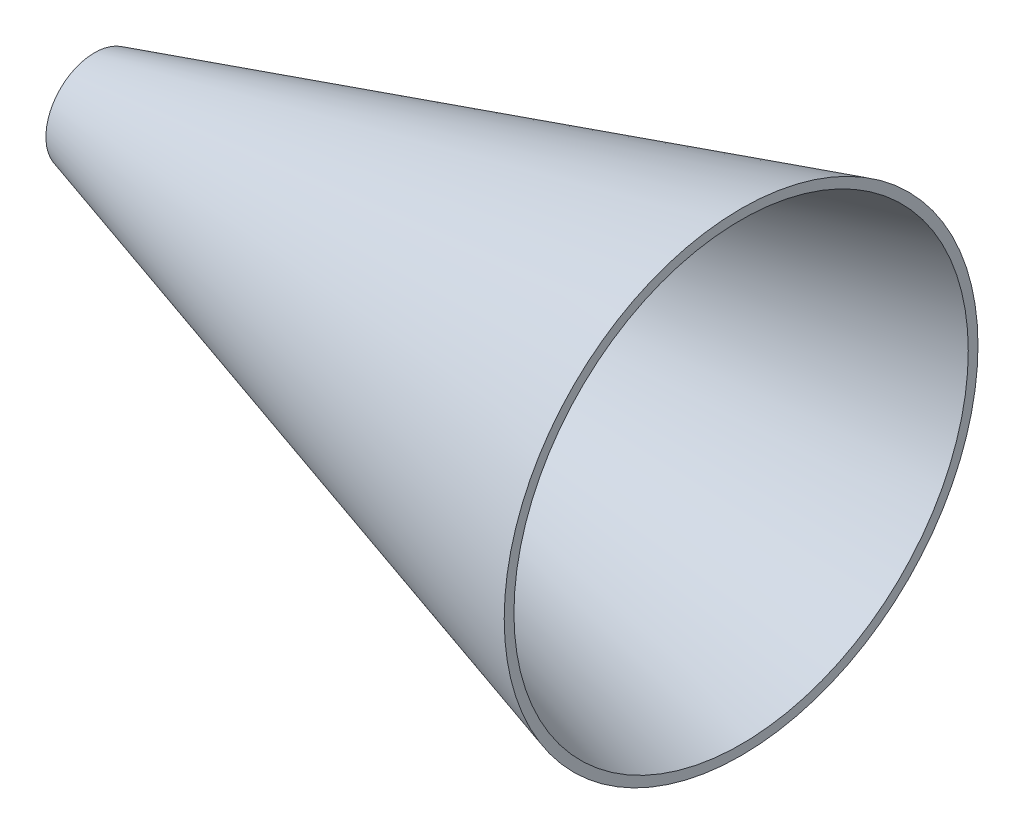
ISO-10303-21;
HEADER;
FILE_DESCRIPTION(('STEP AP214'),'2;1');
FILE_NAME('part.step','',(''),(''),'','','');
FILE_SCHEMA(('AUTOMOTIVE_DESIGN { 1 0 10303 214 1 1 1 1 }'));
ENDSEC;
DATA;
#1=APPLICATION_CONTEXT('core data for automotive mechanical design processes');
#2=APPLICATION_PROTOCOL_DEFINITION('international standard','automotive_design',2000,#1);
#3=PRODUCT_CONTEXT('',#1,'mechanical');
#4=PRODUCT('Part','Part','',(#3));
#5=PRODUCT_RELATED_PRODUCT_CATEGORY('part','',(#4));
#6=PRODUCT_DEFINITION_FORMATION('','',#4);
#7=PRODUCT_DEFINITION_CONTEXT('part definition',#1,'design');
#8=PRODUCT_DEFINITION('design','',#6,#7);
#9=PRODUCT_DEFINITION_SHAPE('','',#8);
#10=(LENGTH_UNIT() NAMED_UNIT(*) SI_UNIT(.MILLI.,.METRE.));
#11=(NAMED_UNIT(*) PLANE_ANGLE_UNIT() SI_UNIT($,.RADIAN.));
#12=(NAMED_UNIT(*) SI_UNIT($,.STERADIAN.) SOLID_ANGLE_UNIT());
#13=UNCERTAINTY_MEASURE_WITH_UNIT(LENGTH_MEASURE(1.E-05),#10,'distance_accuracy_value','');
#14=(GEOMETRIC_REPRESENTATION_CONTEXT(3) GLOBAL_UNCERTAINTY_ASSIGNED_CONTEXT((#13)) GLOBAL_UNIT_ASSIGNED_CONTEXT((#10,
#11,#12)) REPRESENTATION_CONTEXT('',''));
#15=CARTESIAN_POINT('',(0.,0.,0.));
#16=DIRECTION('',(0.,0.,1.));
#17=DIRECTION('',(1.,0.,0.));
#18=AXIS2_PLACEMENT_3D('',#15,#16,#17);
#19=CARTESIAN_POINT('',(0.,0.,0.));
#20=DIRECTION('',(1.,0.,0.));
#21=DIRECTION('',(0.,0.,-1.));
#22=AXIS2_PLACEMENT_3D('',#19,#20,#21);
#23=PLANE('',#22);
#24=CARTESIAN_POINT('',(0.,0.,0.));
#25=DIRECTION('',(-1.,0.,0.));
#26=DIRECTION('',(0.,0.,1.));
#27=AXIS2_PLACEMENT_3D('',#24,#25,#26);
#28=CIRCLE('',#27,1.016);
#29=CARTESIAN_POINT('',(0.,0.,1.016));
#30=VERTEX_POINT('',#29);
#31=EDGE_CURVE('E60',#30,#30,#28,.T.);
#32=ORIENTED_EDGE('',*,*,#31,.F.);
#33=EDGE_LOOP('',(#32));
#34=FACE_BOUND('',#33,.T.);
#35=CARTESIAN_POINT('',(0.,0.,0.));
#36=DIRECTION('',(-1.,0.,0.));
#37=DIRECTION('',(0.,0.,1.));
#38=AXIS2_PLACEMENT_3D('',#35,#36,#37);
#39=CIRCLE('',#38,1.27);
#40=CARTESIAN_POINT('',(0.,0.,-1.27));
#41=VERTEX_POINT('',#40);
#42=EDGE_CURVE('E10',#41,#41,#39,.T.);
#43=ORIENTED_EDGE('',*,*,#42,.T.);
#44=EDGE_LOOP('',(#43));
#45=FACE_BOUND('',#44,.T.);
#46=ADVANCED_FACE('F36',(#34,#45),#23,.F.);
#47=CARTESIAN_POINT('',(16.891,0.,0.));
#48=DIRECTION('',(1.,0.,0.));
#49=DIRECTION('',(0.,0.,-1.));
#50=AXIS2_PLACEMENT_3D('',#47,#48,#49);
#51=CONICAL_SURFACE('',#50,6.18865496633617,0.28336374422544);
#52=CARTESIAN_POINT('',(16.891,0.,0.));
#53=DIRECTION('',(-1.,0.,0.));
#54=DIRECTION('',(0.,0.,1.));
#55=AXIS2_PLACEMENT_3D('',#52,#53,#54);
#56=CIRCLE('',#55,6.18865496633617);
#57=CARTESIAN_POINT('',(16.891,0.,-6.18865496633617));
#58=VERTEX_POINT('',#57);
#59=EDGE_CURVE('E44',#58,#58,#56,.T.);
#60=CARTESIAN_POINT('',(0.,0.,-1.27));
#61=CARTESIAN_POINT('',(0.175947916666666,0.,-1.32123598923267));
#62=CARTESIAN_POINT('',(0.351895833333333,0.,-1.37247197846534));
#63=CARTESIAN_POINT('',(0.703791666666666,0.,-1.47494395693067));
#64=CARTESIAN_POINT('',(0.879739583333333,0.,-1.52617994616334));
#65=CARTESIAN_POINT('',(1.23163541666667,0.,-1.62865192462868));
#66=CARTESIAN_POINT('',(1.40758333333333,0.,-1.67988791386135));
#67=CARTESIAN_POINT('',(1.75947916666667,0.,-1.78235989232668));
#68=CARTESIAN_POINT('',(1.93542708333333,0.,-1.83359588155935));
#69=CARTESIAN_POINT('',(2.28732291666667,0.,-1.93606786002469));
#70=CARTESIAN_POINT('',(2.46327083333333,0.,-1.98730384925736));
#71=CARTESIAN_POINT('',(2.81516666666667,0.,-2.0897758277227));
#72=CARTESIAN_POINT('',(2.99111458333333,0.,-2.14101181695537));
#73=CARTESIAN_POINT('',(3.34301041666667,0.,-2.2434837954207));
#74=CARTESIAN_POINT('',(3.51895833333333,0.,-2.29471978465337));
#75=CARTESIAN_POINT('',(3.87085416666667,0.,-2.39719176311871));
#76=CARTESIAN_POINT('',(4.04680208333333,0.,-2.44842775235138));
#77=CARTESIAN_POINT('',(4.39869791666667,0.,-2.55089973081671));
#78=CARTESIAN_POINT('',(4.57464583333334,0.,-2.60213572004938));
#79=CARTESIAN_POINT('',(4.92654166666667,0.,-2.70460769851472));
#80=CARTESIAN_POINT('',(5.10248958333334,0.,-2.75584368774739));
#81=CARTESIAN_POINT('',(5.45438541666667,0.,-2.85831566621272));
#82=CARTESIAN_POINT('',(5.63033333333334,0.,-2.90955165544539));
#83=CARTESIAN_POINT('',(5.98222916666667,0.,-3.01202363391073));
#84=CARTESIAN_POINT('',(6.15817708333334,0.,-3.0632596231434));
#85=CARTESIAN_POINT('',(6.51007291666667,0.,-3.16573160160873));
#86=CARTESIAN_POINT('',(6.68602083333334,0.,-3.2169675908414));
#87=CARTESIAN_POINT('',(7.03791666666667,0.,-3.31943956930674));
#88=CARTESIAN_POINT('',(7.21386458333334,0.,-3.37067555853941));
#89=CARTESIAN_POINT('',(7.56576041666667,0.,-3.47314753700474));
#90=CARTESIAN_POINT('',(7.74170833333334,0.,-3.52438352623741));
#91=CARTESIAN_POINT('',(8.09360416666667,0.,-3.62685550470275));
#92=CARTESIAN_POINT('',(8.26955208333334,0.,-3.67809149393542));
#93=CARTESIAN_POINT('',(8.62144791666667,0.,-3.78056347240076));
#94=CARTESIAN_POINT('',(8.79739583333334,0.,-3.83179946163342));
#95=CARTESIAN_POINT('',(9.14929166666667,0.,-3.93427144009876));
#96=CARTESIAN_POINT('',(9.32523958333334,0.,-3.98550742933143));
#97=CARTESIAN_POINT('',(9.67713541666667,0.,-4.08797940779677));
#98=CARTESIAN_POINT('',(9.85308333333334,0.,-4.13921539702944));
#99=CARTESIAN_POINT('',(10.2049791666667,0.,-4.24168737549477));
#100=CARTESIAN_POINT('',(10.3809270833333,0.,-4.29292336472744));
#101=CARTESIAN_POINT('',(10.7328229166667,0.,-4.39539534319278));
#102=CARTESIAN_POINT('',(10.9087708333333,0.,-4.44663133242545));
#103=CARTESIAN_POINT('',(11.2606666666667,0.,-4.54910331089078));
#104=CARTESIAN_POINT('',(11.4366145833333,0.,-4.60033930012345));
#105=CARTESIAN_POINT('',(11.7885104166667,0.,-4.70281127858879));
#106=CARTESIAN_POINT('',(11.9644583333333,0.,-4.75404726782146));
#107=CARTESIAN_POINT('',(12.3163541666667,0.,-4.85651924628679));
#108=CARTESIAN_POINT('',(12.4923020833333,0.,-4.90775523551946));
#109=CARTESIAN_POINT('',(12.8441979166667,0.,-5.0102272139848));
#110=CARTESIAN_POINT('',(13.0201458333333,0.,-5.06146320321747));
#111=CARTESIAN_POINT('',(13.3720416666667,0.,-5.16393518168281));
#112=CARTESIAN_POINT('',(13.5479895833333,0.,-5.21517117091547));
#113=CARTESIAN_POINT('',(13.8998854166667,0.,-5.31764314938081));
#114=CARTESIAN_POINT('',(14.0758333333333,0.,-5.36887913861348));
#115=CARTESIAN_POINT('',(14.4277291666667,0.,-5.47135111707882));
#116=CARTESIAN_POINT('',(14.6036770833333,0.,-5.52258710631148));
#117=CARTESIAN_POINT('',(14.9555729166667,0.,-5.62505908477682));
#118=CARTESIAN_POINT('',(15.1315208333333,0.,-5.67629507400949));
#119=CARTESIAN_POINT('',(15.4834166666667,0.,-5.77876705247483));
#120=CARTESIAN_POINT('',(15.6593645833333,0.,-5.8300030417075));
#121=CARTESIAN_POINT('',(16.0112604166667,0.,-5.93247502017283));
#122=CARTESIAN_POINT('',(16.1872083333333,0.,-5.9837110094055));
#123=CARTESIAN_POINT('',(16.5391041666667,0.,-6.08618298787084));
#124=CARTESIAN_POINT('',(16.7150520833333,0.,-6.13741897710351));
#125=CARTESIAN_POINT('',(16.891,0.,-6.18865496633617));
#126=B_SPLINE_CURVE_WITH_KNOTS('',3,(#60,#61,#62,#63,#64,#65,#66,#67,#68,#69,#70,#71,#72,#73,
#74,#75,#76,#77,#78,#79,#80,#81,#82,#83,#84,#85,#86,#87,#88,#89,#90,#91,#92,#93,#94,#95,#96,#97,
#98,#99,#100,#101,#102,#103,#104,#105,#106,#107,#108,#109,#110,#111,#112,#113,#114,#115,#116,
#117,#118,#119,#120,#121,#122,#123,#124,#125),.UNSPECIFIED.,.F.,.F.,(4,2,2,2,2,2,2,2,2,2,2,2,2,
2,2,2,2,2,2,2,2,2,2,2,2,2,2,2,2,2,2,2,4),(0.,0.549768281867837,1.09953656373567,
1.64930484560351,2.19907312747135,2.74884140933919,3.29860969120702,3.84837797307486,
4.3981462549427,4.94791453681054,5.49768281867837,6.04745110054621,6.59721938241405,
7.14698766428189,7.69675594614972,8.24652422801756,8.7962925098854,9.34606079175324,
9.89582907362107,10.4455973554889,10.9953656373567,11.5451339192246,12.0949022010924,
12.6446704829603,13.1944387648281,13.7442070466959,14.2939753285638,14.8437436104316,
15.3935118922995,15.9432801741673,16.4930484560351,17.042816737903,17.5925850197708),.UNSPECIFIED.);
#127=EDGE_CURVE('BSEAM83',#41,#58,#126,.T.);
#128=ORIENTED_EDGE('',*,*,#42,.F.);
#129=ORIENTED_EDGE('',*,*,#59,.T.);
#130=ORIENTED_EDGE('',*,*,#127,.T.);
#131=ORIENTED_EDGE('',*,*,#127,.F.);
#132=EDGE_LOOP('',(#128,#130,#129,#131));
#133=FACE_BOUND('',#132,.T.);
#134=ADVANCED_FACE('F83',(#133),#51,.T.);
#135=CARTESIAN_POINT('',(16.891,6.18865496633617,0.));
#136=DIRECTION('',(-1.,0.,0.));
#137=DIRECTION('',(0.,0.,1.));
#138=AXIS2_PLACEMENT_3D('',#135,#136,#137);
#139=PLANE('',#138);
#140=ORIENTED_EDGE('',*,*,#59,.F.);
#141=EDGE_LOOP('',(#140));
#142=FACE_BOUND('',#141,.T.);
#143=CARTESIAN_POINT('',(16.891,0.,0.));
#144=DIRECTION('',(-1.,0.,0.));
#145=DIRECTION('',(0.,0.,1.));
#146=AXIS2_PLACEMENT_3D('',#143,#144,#145);
#147=CIRCLE('',#146,5.93465496633617);
#148=CARTESIAN_POINT('',(16.891,0.,-5.93465496633617));
#149=VERTEX_POINT('',#148);
#150=EDGE_CURVE('E50',#149,#149,#147,.T.);
#151=ORIENTED_EDGE('',*,*,#150,.T.);
#152=EDGE_LOOP('',(#151));
#153=FACE_BOUND('',#152,.T.);
#154=ADVANCED_FACE('F88',(#142,#153),#139,.F.);
#155=CARTESIAN_POINT('',(0.254000000000004,0.,0.));
#156=DIRECTION('',(1.,0.,0.));
#157=DIRECTION('',(0.,0.,-1.));
#158=AXIS2_PLACEMENT_3D('',#155,#156,#157);
#159=CONICAL_SURFACE('',#158,1.08996473633588,0.28336374422544);
#160=CARTESIAN_POINT('',(0.254000000000004,0.,0.));
#161=DIRECTION('',(-1.,0.,0.));
#162=DIRECTION('',(0.,0.,1.));
#163=AXIS2_PLACEMENT_3D('',#160,#161,#162);
#164=CIRCLE('',#163,1.08996473633588);
#165=CARTESIAN_POINT('',(0.254000000000004,0.,-1.08996473633588));
#166=VERTEX_POINT('',#165);
#167=EDGE_CURVE('E56',#166,#166,#164,.T.);
#168=CARTESIAN_POINT('',(16.891,0.,-5.93465496633617));
#169=CARTESIAN_POINT('',(16.7176979166667,0.,-5.884189443107));
#170=CARTESIAN_POINT('',(16.5443958333333,0.,-5.83372391987783));
#171=CARTESIAN_POINT('',(16.1977916666667,0.,-5.73279287341949));
#172=CARTESIAN_POINT('',(16.0244895833333,0.,-5.68232735019033));
#173=CARTESIAN_POINT('',(15.6778854166667,0.,-5.58139630373199));
#174=CARTESIAN_POINT('',(15.5045833333333,0.,-5.53093078050282));
#175=CARTESIAN_POINT('',(15.1579791666667,0.,-5.42999973404448));
#176=CARTESIAN_POINT('',(14.9846770833333,0.,-5.37953421081531));
#177=CARTESIAN_POINT('',(14.6380729166667,0.,-5.27860316435697));
#178=CARTESIAN_POINT('',(14.4647708333333,0.,-5.2281376411278));
#179=CARTESIAN_POINT('',(14.1181666666667,0.,-5.12720659466946));
#180=CARTESIAN_POINT('',(13.9448645833333,0.,-5.07674107144029));
#181=CARTESIAN_POINT('',(13.5982604166667,0.,-4.97581002498195));
#182=CARTESIAN_POINT('',(13.4249583333333,0.,-4.92534450175278));
#183=CARTESIAN_POINT('',(13.0783541666667,0.,-4.82441345529444));
#184=CARTESIAN_POINT('',(12.9050520833333,0.,-4.77394793206527));
#185=CARTESIAN_POINT('',(12.5584479166667,0.,-4.67301688560693));
#186=CARTESIAN_POINT('',(12.3851458333333,0.,-4.62255136237776));
#187=CARTESIAN_POINT('',(12.0385416666667,0.,-4.52162031591942));
#188=CARTESIAN_POINT('',(11.8652395833333,0.,-4.47115479269025));
#189=CARTESIAN_POINT('',(11.5186354166667,0.,-4.37022374623191));
#190=CARTESIAN_POINT('',(11.3453333333333,0.,-4.31975822300274));
#191=CARTESIAN_POINT('',(10.9987291666667,0.,-4.2188271765444));
#192=CARTESIAN_POINT('',(10.8254270833333,0.,-4.16836165331523));
#193=CARTESIAN_POINT('',(10.4788229166667,0.,-4.0674306068569));
#194=CARTESIAN_POINT('',(10.3055208333333,0.,-4.01696508362772));
#195=CARTESIAN_POINT('',(9.95891666666667,0.,-3.91603403716939));
#196=CARTESIAN_POINT('',(9.78561458333334,0.,-3.86556851394022));
#197=CARTESIAN_POINT('',(9.43901041666667,0.,-3.76463746748188));
#198=CARTESIAN_POINT('',(9.26570833333334,0.,-3.71417194425271));
#199=CARTESIAN_POINT('',(8.91910416666667,0.,-3.61324089779437));
#200=CARTESIAN_POINT('',(8.74580208333334,0.,-3.5627753745652));
#201=CARTESIAN_POINT('',(8.39919791666667,0.,-3.46184432810686));
#202=CARTESIAN_POINT('',(8.22589583333334,0.,-3.41137880487769));
#203=CARTESIAN_POINT('',(7.87929166666667,0.,-3.31044775841935));
#204=CARTESIAN_POINT('',(7.70598958333334,0.,-3.25998223519018));
#205=CARTESIAN_POINT('',(7.35938541666667,0.,-3.15905118873184));
#206=CARTESIAN_POINT('',(7.18608333333334,0.,-3.10858566550267));
#207=CARTESIAN_POINT('',(6.83947916666667,0.,-3.00765461904433));
#208=CARTESIAN_POINT('',(6.66617708333334,0.,-2.95718909581516));
#209=CARTESIAN_POINT('',(6.31957291666667,0.,-2.85625804935682));
#210=CARTESIAN_POINT('',(6.14627083333334,0.,-2.80579252612765));
#211=CARTESIAN_POINT('',(5.79966666666667,0.,-2.70486147966931));
#212=CARTESIAN_POINT('',(5.62636458333334,0.,-2.65439595644014));
#213=CARTESIAN_POINT('',(5.27976041666667,0.,-2.5534649099818));
#214=CARTESIAN_POINT('',(5.10645833333334,0.,-2.50299938675263));
#215=CARTESIAN_POINT('',(4.75985416666667,0.,-2.40206834029429));
#216=CARTESIAN_POINT('',(4.58655208333334,0.,-2.35160281706512));
#217=CARTESIAN_POINT('',(4.23994791666667,0.,-2.25067177060678));
#218=CARTESIAN_POINT('',(4.06664583333334,0.,-2.20020624737761));
#219=CARTESIAN_POINT('',(3.72004166666667,0.,-2.09927520091927));
#220=CARTESIAN_POINT('',(3.54673958333334,0.,-2.0488096776901));
#221=CARTESIAN_POINT('',(3.20013541666667,0.,-1.94787863123177));
#222=CARTESIAN_POINT('',(3.02683333333334,0.,-1.8974131080026));
#223=CARTESIAN_POINT('',(2.68022916666667,0.,-1.79648206154426));
#224=CARTESIAN_POINT('',(2.50692708333334,0.,-1.74601653831509));
#225=CARTESIAN_POINT('',(2.16032291666667,0.,-1.64508549185675));
#226=CARTESIAN_POINT('',(1.98702083333334,0.,-1.59461996862758));
#227=CARTESIAN_POINT('',(1.64041666666667,0.,-1.49368892216924));
#228=CARTESIAN_POINT('',(1.46711458333334,0.,-1.44322339894007));
#229=CARTESIAN_POINT('',(1.12051041666667,0.,-1.34229235248173));
#230=CARTESIAN_POINT('',(0.947208333333338,0.,-1.29182682925256));
#231=CARTESIAN_POINT('',(0.600604166666671,0.,-1.19089578279422));
#232=CARTESIAN_POINT('',(0.427302083333338,0.,-1.14043025956505));
#233=CARTESIAN_POINT('',(0.254000000000004,0.,-1.08996473633588));
#234=B_SPLINE_CURVE_WITH_KNOTS('',3,(#168,#169,#170,#171,#172,#173,#174,#175,#176,#177,#178,
#179,#180,#181,#182,#183,#184,#185,#186,#187,#188,#189,#190,#191,#192,#193,#194,#195,#196,#197,
#198,#199,#200,#201,#202,#203,#204,#205,#206,#207,#208,#209,#210,#211,#212,#213,#214,#215,#216,
#217,#218,#219,#220,#221,#222,#223,#224,#225,#226,#227,#228,#229,#230,#231,#232,#233),
.UNSPECIFIED.,.F.,.F.,(4,2,2,2,2,2,2,2,2,2,2,2,2,2,2,2,2,2,2,2,2,2,2,2,2,2,2,2,2,2,2,2,4),(0.,
0.541501089659299,1.0830021793186,1.62450326897789,2.16600435863719,2.70750544829649,
3.24900653795579,3.79050762761509,4.33200871727439,4.87350980693368,5.41501089659298,
5.95651198625228,6.49801307591158,7.03951416557088,7.58101525523018,8.12251634488947,
8.66401743454877,9.20551852420807,9.74701961386737,10.2885207035267,10.830021793186,
11.3715228828453,11.9130239725046,12.4545250621639,12.9960261518232,13.5375272414825,
14.0790283311418,14.6205294208011,15.1620305104604,15.7035316001197,16.2450326897789,
16.7865337794382,17.3280348690975),.UNSPECIFIED.);
#235=EDGE_CURVE('BSEAM80',#149,#166,#234,.T.);
#236=ORIENTED_EDGE('',*,*,#150,.F.);
#237=ORIENTED_EDGE('',*,*,#167,.T.);
#238=ORIENTED_EDGE('',*,*,#235,.T.);
#239=ORIENTED_EDGE('',*,*,#235,.F.);
#240=EDGE_LOOP('',(#236,#238,#237,#239));
#241=FACE_BOUND('',#240,.T.);
#242=ADVANCED_FACE('F80',(#241),#159,.F.);
#243=CARTESIAN_POINT('',(0.254,1.08996473633588,0.));
#244=DIRECTION('',(-1.,0.,0.));
#245=DIRECTION('',(0.,0.,1.));
#246=AXIS2_PLACEMENT_3D('',#243,#244,#245);
#247=PLANE('',#246);
#248=CARTESIAN_POINT('',(0.254,0.,0.));
#249=DIRECTION('',(-1.,0.,0.));
#250=DIRECTION('',(0.,0.,1.));
#251=AXIS2_PLACEMENT_3D('',#248,#249,#250);
#252=CIRCLE('',#251,1.016);
#253=CARTESIAN_POINT('',(0.254,0.,1.016));
#254=VERTEX_POINT('',#253);
#255=EDGE_CURVE('E39',#254,#254,#252,.T.);
#256=ORIENTED_EDGE('',*,*,#255,.T.);
#257=EDGE_LOOP('',(#256));
#258=FACE_BOUND('',#257,.T.);
#259=ORIENTED_EDGE('',*,*,#167,.F.);
#260=EDGE_LOOP('',(#259));
#261=FACE_BOUND('',#260,.T.);
#262=ADVANCED_FACE('F71',(#258,#261),#247,.F.);
#263=CARTESIAN_POINT('',(2.54,0.,0.));
#264=DIRECTION('',(-1.,0.,0.));
#265=DIRECTION('',(0.,0.,1.));
#266=AXIS2_PLACEMENT_3D('',#263,#264,#265);
#267=CYLINDRICAL_SURFACE('',#266,1.016);
#268=ORIENTED_EDGE('',*,*,#31,.T.);
#269=EDGE_LOOP('',(#268));
#270=FACE_BOUND('',#269,.T.);
#271=ORIENTED_EDGE('',*,*,#255,.F.);
#272=EDGE_LOOP('',(#271));
#273=FACE_BOUND('',#272,.T.);
#274=ADVANCED_FACE('F74',(#270,#273),#267,.F.);
#275=CLOSED_SHELL('',(#46,#134,#154,#242,#262,#274));
#276=MANIFOLD_SOLID_BREP('B2',#275);
#277=ADVANCED_BREP_SHAPE_REPRESENTATION('',(#18,#276),#14);
#278=SHAPE_DEFINITION_REPRESENTATION(#9,#277);
ENDSEC;
END-ISO-10303-21;
